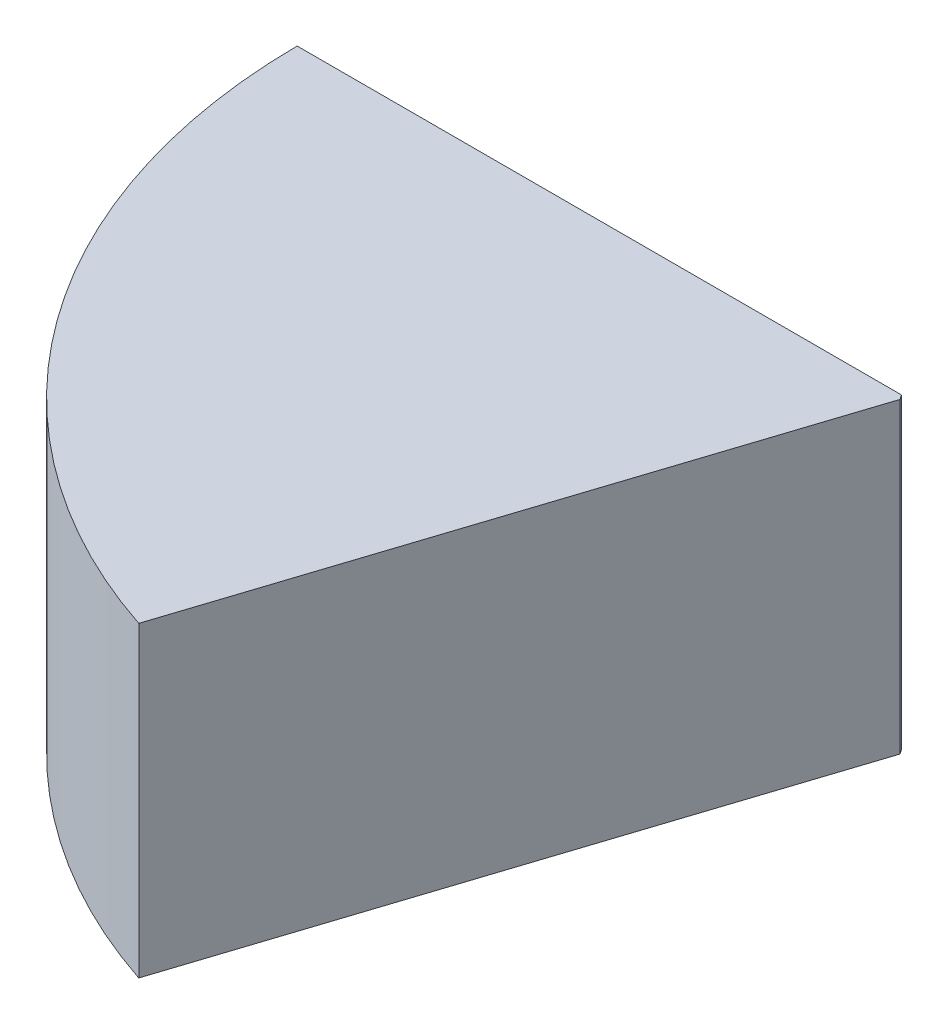
ISO-10303-21;
HEADER;
FILE_DESCRIPTION(('STEP AP214'),'2;1');
FILE_NAME('part.step','',(''),(''),'','','');
FILE_SCHEMA(('AUTOMOTIVE_DESIGN { 1 0 10303 214 1 1 1 1 }'));
ENDSEC;
DATA;
#1=APPLICATION_CONTEXT('core data for automotive mechanical design processes');
#2=APPLICATION_PROTOCOL_DEFINITION('international standard','automotive_design',2000,#1);
#3=PRODUCT_CONTEXT('',#1,'mechanical');
#4=PRODUCT('Part','Part','',(#3));
#5=PRODUCT_RELATED_PRODUCT_CATEGORY('part','',(#4));
#6=PRODUCT_DEFINITION_FORMATION('','',#4);
#7=PRODUCT_DEFINITION_CONTEXT('part definition',#1,'design');
#8=PRODUCT_DEFINITION('design','',#6,#7);
#9=PRODUCT_DEFINITION_SHAPE('','',#8);
#10=(LENGTH_UNIT() NAMED_UNIT(*) SI_UNIT(.MILLI.,.METRE.));
#11=(NAMED_UNIT(*) PLANE_ANGLE_UNIT() SI_UNIT($,.RADIAN.));
#12=(NAMED_UNIT(*) SI_UNIT($,.STERADIAN.) SOLID_ANGLE_UNIT());
#13=UNCERTAINTY_MEASURE_WITH_UNIT(LENGTH_MEASURE(1.E-05),#10,'distance_accuracy_value','');
#14=(GEOMETRIC_REPRESENTATION_CONTEXT(3) GLOBAL_UNCERTAINTY_ASSIGNED_CONTEXT((#13)) GLOBAL_UNIT_ASSIGNED_CONTEXT((#10,
#11,#12)) REPRESENTATION_CONTEXT('',''));
#15=CARTESIAN_POINT('',(0.,0.,0.));
#16=DIRECTION('',(0.,0.,1.));
#17=DIRECTION('',(1.,0.,0.));
#18=AXIS2_PLACEMENT_3D('',#15,#16,#17);
#19=CARTESIAN_POINT('',(-31.3961266284944,0.,96.6273420555877));
#20=DIRECTION('',(0.,1.,0.));
#21=DIRECTION('',(0.,0.,1.));
#22=AXIS2_PLACEMENT_3D('',#19,#20,#21);
#23=PLANE('',#22);
#24=DIRECTION('',(-1.,0.,0.));
#25=VECTOR('',#24,1.);
#26=CARTESIAN_POINT('',(-0.667678512391301,0.,0.635));
#27=LINE('',#26,#25);
#28=CARTESIAN_POINT('',(-1.65890568521156,0.,0.635));
#29=VERTEX_POINT('',#28);
#30=CARTESIAN_POINT('',(-101.598015605621,0.,0.635));
#31=VERTEX_POINT('',#30);
#32=EDGE_CURVE('E92',#29,#31,#27,.T.);
#33=ORIENTED_EDGE('',*,*,#32,.F.);
#34=DIRECTION('',(-0.587785252292474,0.,-0.809016994374947));
#35=VECTOR('',#34,1.);
#36=CARTESIAN_POINT('',(-1.11655093664301,0.,1.38148727041144));
#37=LINE('',#36,#35);
#38=CARTESIAN_POINT('',(-1.11655093664301,0.,1.38148727041144));
#39=VERTEX_POINT('',#38);
#40=EDGE_CURVE('E48',#39,#29,#37,.T.);
#41=ORIENTED_EDGE('',*,*,#40,.F.);
#42=DIRECTION('',(0.309016994374945,0.,-0.951056516295154));
#43=VECTOR('',#42,1.);
#44=CARTESIAN_POINT('',(-32.0000475163418,0.,96.4311162641596));
#45=LINE('',#44,#43);
#46=CARTESIAN_POINT('',(-31.9994343047552,0.,96.4292289929545));
#47=VERTEX_POINT('',#46);
#48=EDGE_CURVE('E98',#47,#39,#45,.T.);
#49=ORIENTED_EDGE('',*,*,#48,.F.);
#50=CARTESIAN_POINT('',(0.,0.,0.));
#51=DIRECTION('',(0.,-1.,0.));
#52=DIRECTION('',(0.,0.,-1.));
#53=AXIS2_PLACEMENT_3D('',#50,#51,#52);
#54=CIRCLE('',#53,101.6);
#55=EDGE_CURVE('E41',#47,#31,#54,.T.);
#56=ORIENTED_EDGE('',*,*,#55,.T.);
#57=EDGE_LOOP('',(#33,#41,#49,#56));
#58=FACE_BOUND('',#57,.T.);
#59=ADVANCED_FACE('F33',(#58),#23,.F.);
#60=CARTESIAN_POINT('',(0.,50.8,0.));
#61=DIRECTION('',(0.,-1.,0.));
#62=DIRECTION('',(0.,0.,-1.));
#63=AXIS2_PLACEMENT_3D('',#60,#61,#62);
#64=PLANE('',#63);
#65=DIRECTION('',(-0.309016994374945,0.,0.951056516295154));
#66=VECTOR('',#65,1.);
#67=CARTESIAN_POINT('',(-0.603920887847423,50.8,-0.19622579142809));
#68=LINE('',#67,#66);
#69=CARTESIAN_POINT('',(-1.11655093664301,50.8,1.38148727041144));
#70=VERTEX_POINT('',#69);
#71=CARTESIAN_POINT('',(-31.9994343047552,50.8,96.4292289929545));
#72=VERTEX_POINT('',#71);
#73=EDGE_CURVE('E87',#70,#72,#68,.T.);
#74=ORIENTED_EDGE('',*,*,#73,.F.);
#75=DIRECTION('',(0.587785252292474,0.,0.809016994374947));
#76=VECTOR('',#75,1.);
#77=CARTESIAN_POINT('',(-1.11655093664301,50.8,1.38148727041144));
#78=LINE('',#77,#76);
#79=CARTESIAN_POINT('',(-1.65890568521156,50.8,0.635));
#80=VERTEX_POINT('',#79);
#81=EDGE_CURVE('E75',#80,#70,#78,.T.);
#82=ORIENTED_EDGE('',*,*,#81,.F.);
#83=DIRECTION('',(1.,0.,0.));
#84=VECTOR('',#83,1.);
#85=CARTESIAN_POINT('',(-101.6,50.8,0.635));
#86=LINE('',#85,#84);
#87=CARTESIAN_POINT('',(-101.598015605621,50.8,0.635));
#88=VERTEX_POINT('',#87);
#89=EDGE_CURVE('E86',#88,#80,#86,.T.);
#90=ORIENTED_EDGE('',*,*,#89,.F.);
#91=CARTESIAN_POINT('',(0.,50.8,0.));
#92=DIRECTION('',(0.,-1.,0.));
#93=DIRECTION('',(0.,0.,-1.));
#94=AXIS2_PLACEMENT_3D('',#91,#92,#93);
#95=CIRCLE('',#94,101.6);
#96=EDGE_CURVE('E11',#72,#88,#95,.T.);
#97=ORIENTED_EDGE('',*,*,#96,.F.);
#98=EDGE_LOOP('',(#74,#82,#90,#97));
#99=FACE_BOUND('',#98,.T.);
#100=ADVANCED_FACE('F35',(#99),#64,.F.);
#101=CARTESIAN_POINT('',(0.,0.,0.));
#102=DIRECTION('',(0.,-1.,0.));
#103=DIRECTION('',(0.,0.,-1.));
#104=AXIS2_PLACEMENT_3D('',#101,#102,#103);
#105=CYLINDRICAL_SURFACE('',#104,101.6);
#106=DIRECTION('',(0.,-1.,0.));
#107=VECTOR('',#106,1.);
#108=CARTESIAN_POINT('',(-101.598015605621,0.,0.635));
#109=LINE('',#108,#107);
#110=EDGE_CURVE('E91',#31,#88,#109,.F.);
#111=ORIENTED_EDGE('',*,*,#110,.F.);
#112=ORIENTED_EDGE('',*,*,#55,.F.);
#113=DIRECTION('',(0.,-1.,0.));
#114=VECTOR('',#113,1.);
#115=CARTESIAN_POINT('',(-31.9994343047552,0.,96.4292289929545));
#116=LINE('',#115,#114);
#117=EDGE_CURVE('E56',#72,#47,#116,.T.);
#118=ORIENTED_EDGE('',*,*,#117,.F.);
#119=ORIENTED_EDGE('',*,*,#96,.T.);
#120=EDGE_LOOP('',(#111,#112,#118,#119));
#121=FACE_BOUND('',#120,.T.);
#122=ADVANCED_FACE('F105',(#121),#105,.T.);
#123=CARTESIAN_POINT('',(-0.603920887847423,0.,-0.19622579142809));
#124=DIRECTION('',(0.951056516295155,0.,0.309016994374945));
#125=DIRECTION('',(0.309016994374945,0.,-0.951056516295155));
#126=AXIS2_PLACEMENT_3D('',#123,#124,#125);
#127=PLANE('',#126);
#128=DIRECTION('',(0.,1.,0.));
#129=VECTOR('',#128,1.);
#130=CARTESIAN_POINT('',(-1.11655093664301,-0.001000000000001,1.38148727041144));
#131=LINE('',#130,#129);
#132=EDGE_CURVE('E80',#39,#70,#131,.T.);
#133=ORIENTED_EDGE('',*,*,#132,.T.);
#134=ORIENTED_EDGE('',*,*,#73,.T.);
#135=ORIENTED_EDGE('',*,*,#117,.T.);
#136=ORIENTED_EDGE('',*,*,#48,.T.);
#137=EDGE_LOOP('',(#133,#134,#135,#136));
#138=FACE_BOUND('',#137,.T.);
#139=ADVANCED_FACE('F107',(#138),#127,.T.);
#140=CARTESIAN_POINT('',(0.,0.,0.635));
#141=DIRECTION('',(0.,0.,-1.));
#142=DIRECTION('',(-1.,0.,0.));
#143=AXIS2_PLACEMENT_3D('',#140,#141,#142);
#144=PLANE('',#143);
#145=DIRECTION('',(0.,1.,0.));
#146=VECTOR('',#145,1.);
#147=CARTESIAN_POINT('',(-1.65890568521156,-0.001000000000001,0.635));
#148=LINE('',#147,#146);
#149=EDGE_CURVE('E72',#29,#80,#148,.T.);
#150=ORIENTED_EDGE('',*,*,#149,.F.);
#151=ORIENTED_EDGE('',*,*,#32,.T.);
#152=ORIENTED_EDGE('',*,*,#110,.T.);
#153=ORIENTED_EDGE('',*,*,#89,.T.);
#154=EDGE_LOOP('',(#150,#151,#152,#153));
#155=FACE_BOUND('',#154,.T.);
#156=ADVANCED_FACE('F89',(#155),#144,.T.);
#157=CARTESIAN_POINT('',(-1.11655093664301,-0.001000000000001,1.38148727041144));
#158=DIRECTION('',(-0.809016994374947,0.,0.587785252292474));
#159=DIRECTION('',(0.587785252292474,0.,0.809016994374947));
#160=AXIS2_PLACEMENT_3D('',#157,#158,#159);
#161=PLANE('',#160);
#162=ORIENTED_EDGE('',*,*,#40,.T.);
#163=ORIENTED_EDGE('',*,*,#149,.T.);
#164=ORIENTED_EDGE('',*,*,#81,.T.);
#165=ORIENTED_EDGE('',*,*,#132,.F.);
#166=EDGE_LOOP('',(#162,#163,#164,#165));
#167=FACE_BOUND('',#166,.T.);
#168=ADVANCED_FACE('F74',(#167),#161,.F.);
#169=CLOSED_SHELL('',(#59,#100,#122,#139,#156,#168));
#170=MANIFOLD_SOLID_BREP('B2',#169);
#171=ADVANCED_BREP_SHAPE_REPRESENTATION('',(#18,#170),#14);
#172=SHAPE_DEFINITION_REPRESENTATION(#9,#171);
ENDSEC;
END-ISO-10303-21;
